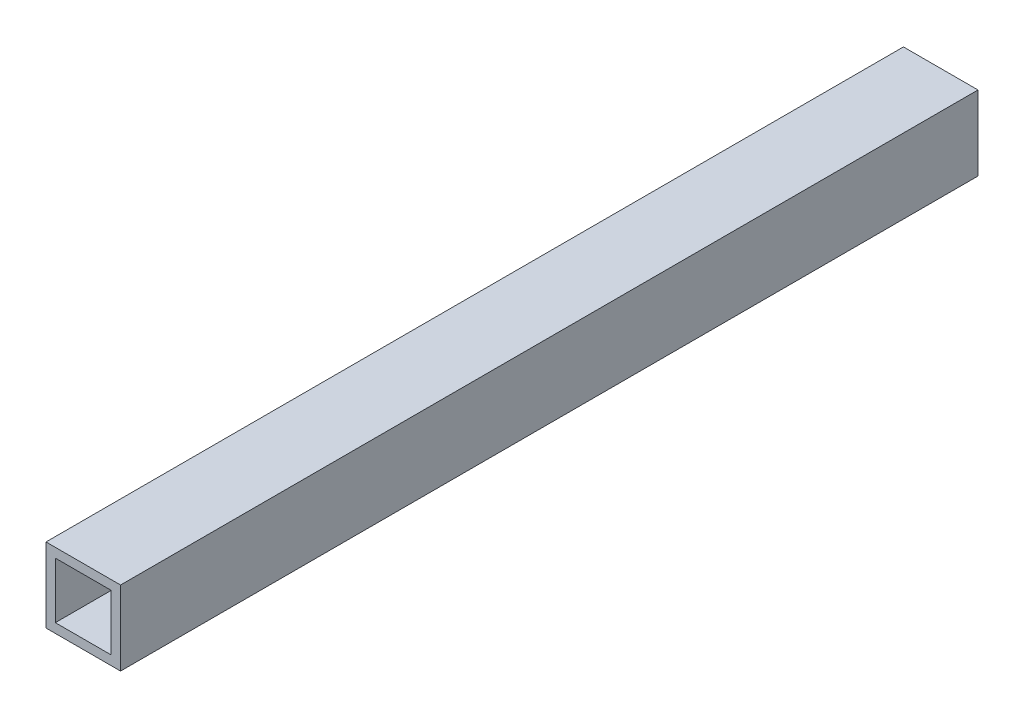
ISO-10303-21;
HEADER;
FILE_DESCRIPTION(('STEP AP214'),'2;1');
FILE_NAME('part.step','',(''),(''),'','','');
FILE_SCHEMA(('AUTOMOTIVE_DESIGN { 1 0 10303 214 1 1 1 1 }'));
ENDSEC;
DATA;
#1=APPLICATION_CONTEXT('core data for automotive mechanical design processes');
#2=APPLICATION_PROTOCOL_DEFINITION('international standard','automotive_design',2000,#1);
#3=PRODUCT_CONTEXT('',#1,'mechanical');
#4=PRODUCT('Part','Part','',(#3));
#5=PRODUCT_RELATED_PRODUCT_CATEGORY('part','',(#4));
#6=PRODUCT_DEFINITION_FORMATION('','',#4);
#7=PRODUCT_DEFINITION_CONTEXT('part definition',#1,'design');
#8=PRODUCT_DEFINITION('design','',#6,#7);
#9=PRODUCT_DEFINITION_SHAPE('','',#8);
#10=(LENGTH_UNIT() NAMED_UNIT(*) SI_UNIT(.MILLI.,.METRE.));
#11=(NAMED_UNIT(*) PLANE_ANGLE_UNIT() SI_UNIT($,.RADIAN.));
#12=(NAMED_UNIT(*) SI_UNIT($,.STERADIAN.) SOLID_ANGLE_UNIT());
#13=UNCERTAINTY_MEASURE_WITH_UNIT(LENGTH_MEASURE(1.E-05),#10,'distance_accuracy_value','');
#14=(GEOMETRIC_REPRESENTATION_CONTEXT(3) GLOBAL_UNCERTAINTY_ASSIGNED_CONTEXT((#13)) GLOBAL_UNIT_ASSIGNED_CONTEXT((#10,
#11,#12)) REPRESENTATION_CONTEXT('',''));
#15=CARTESIAN_POINT('',(0.,0.,0.));
#16=DIRECTION('',(0.,0.,1.));
#17=DIRECTION('',(1.,0.,0.));
#18=AXIS2_PLACEMENT_3D('',#15,#16,#17);
#19=CARTESIAN_POINT('',(0.,0.,146.05));
#20=DIRECTION('',(0.,0.,1.));
#21=DIRECTION('',(1.,0.,0.));
#22=AXIS2_PLACEMENT_3D('',#19,#20,#21);
#23=PLANE('',#22);
#24=DIRECTION('',(0.,-1.,0.));
#25=VECTOR('',#24,1.);
#26=CARTESIAN_POINT('',(-12.7,-12.7,146.05));
#27=LINE('',#26,#25);
#28=CARTESIAN_POINT('',(-12.7,12.7,146.05));
#29=VERTEX_POINT('',#28);
#30=CARTESIAN_POINT('',(-12.7,-12.7,146.05));
#31=VERTEX_POINT('',#30);
#32=EDGE_CURVE('E117',#29,#31,#27,.T.);
#33=ORIENTED_EDGE('',*,*,#32,.T.);
#34=DIRECTION('',(1.,0.,0.));
#35=VECTOR('',#34,1.);
#36=CARTESIAN_POINT('',(12.7,-12.7,146.05));
#37=LINE('',#36,#35);
#38=CARTESIAN_POINT('',(12.7,-12.7,146.05));
#39=VERTEX_POINT('',#38);
#40=EDGE_CURVE('E176',#31,#39,#37,.T.);
#41=ORIENTED_EDGE('',*,*,#40,.T.);
#42=DIRECTION('',(0.,1.,0.));
#43=VECTOR('',#42,1.);
#44=CARTESIAN_POINT('',(12.7,-12.7,146.05));
#45=LINE('',#44,#43);
#46=CARTESIAN_POINT('',(12.7,12.7,146.05));
#47=VERTEX_POINT('',#46);
#48=EDGE_CURVE('E179',#39,#47,#45,.T.);
#49=ORIENTED_EDGE('',*,*,#48,.T.);
#50=DIRECTION('',(-1.,0.,0.));
#51=VECTOR('',#50,1.);
#52=CARTESIAN_POINT('',(12.7,12.7,146.05));
#53=LINE('',#52,#51);
#54=EDGE_CURVE('E63',#47,#29,#53,.T.);
#55=ORIENTED_EDGE('',*,*,#54,.T.);
#56=EDGE_LOOP('',(#33,#41,#49,#55));
#57=FACE_BOUND('',#56,.T.);
#58=DIRECTION('',(1.,0.,0.));
#59=VECTOR('',#58,1.);
#60=CARTESIAN_POINT('',(9.525,-9.525,146.05));
#61=LINE('',#60,#59);
#62=CARTESIAN_POINT('',(-9.52499999999999,-9.525,146.05));
#63=VERTEX_POINT('',#62);
#64=CARTESIAN_POINT('',(9.525,-9.525,146.05));
#65=VERTEX_POINT('',#64);
#66=EDGE_CURVE('E158',#63,#65,#61,.T.);
#67=ORIENTED_EDGE('',*,*,#66,.F.);
#68=DIRECTION('',(0.,-1.,0.));
#69=VECTOR('',#68,1.);
#70=CARTESIAN_POINT('',(-9.52499999999999,-9.525,146.05));
#71=LINE('',#70,#69);
#72=CARTESIAN_POINT('',(-9.52499999999999,9.525,146.05));
#73=VERTEX_POINT('',#72);
#74=EDGE_CURVE('E113',#73,#63,#71,.T.);
#75=ORIENTED_EDGE('',*,*,#74,.F.);
#76=DIRECTION('',(-1.,0.,0.));
#77=VECTOR('',#76,1.);
#78=CARTESIAN_POINT('',(9.525,9.525,146.05));
#79=LINE('',#78,#77);
#80=CARTESIAN_POINT('',(9.525,9.525,146.05));
#81=VERTEX_POINT('',#80);
#82=EDGE_CURVE('E164',#81,#73,#79,.T.);
#83=ORIENTED_EDGE('',*,*,#82,.F.);
#84=DIRECTION('',(0.,1.,0.));
#85=VECTOR('',#84,1.);
#86=CARTESIAN_POINT('',(9.525,-9.525,146.05));
#87=LINE('',#86,#85);
#88=EDGE_CURVE('E161',#65,#81,#87,.T.);
#89=ORIENTED_EDGE('',*,*,#88,.F.);
#90=EDGE_LOOP('',(#67,#75,#83,#89));
#91=FACE_BOUND('',#90,.T.);
#92=ADVANCED_FACE('F39',(#57,#91),#23,.T.);
#93=CARTESIAN_POINT('',(-12.7,-12.7,146.05));
#94=DIRECTION('',(1.,0.,0.));
#95=DIRECTION('',(0.,0.,-1.));
#96=AXIS2_PLACEMENT_3D('',#93,#94,#95);
#97=PLANE('',#96);
#98=DIRECTION('',(0.,0.,-1.));
#99=VECTOR('',#98,1.);
#100=CARTESIAN_POINT('',(-12.7,12.7,146.05));
#101=LINE('',#100,#99);
#102=CARTESIAN_POINT('',(-12.7,12.7,-146.05));
#103=VERTEX_POINT('',#102);
#104=EDGE_CURVE('E184',#29,#103,#101,.T.);
#105=ORIENTED_EDGE('',*,*,#104,.T.);
#106=DIRECTION('',(0.,-1.,0.));
#107=VECTOR('',#106,1.);
#108=CARTESIAN_POINT('',(-12.7,-12.7,-146.05));
#109=LINE('',#108,#107);
#110=CARTESIAN_POINT('',(-12.7,-12.7,-146.05));
#111=VERTEX_POINT('',#110);
#112=EDGE_CURVE('E140',#103,#111,#109,.T.);
#113=ORIENTED_EDGE('',*,*,#112,.T.);
#114=DIRECTION('',(0.,0.,-1.));
#115=VECTOR('',#114,1.);
#116=CARTESIAN_POINT('',(-12.7,-12.7,146.05));
#117=LINE('',#116,#115);
#118=EDGE_CURVE('E11',#31,#111,#117,.T.);
#119=ORIENTED_EDGE('',*,*,#118,.F.);
#120=ORIENTED_EDGE('',*,*,#32,.F.);
#121=EDGE_LOOP('',(#105,#113,#119,#120));
#122=FACE_BOUND('',#121,.T.);
#123=ADVANCED_FACE('F41',(#122),#97,.F.);
#124=CARTESIAN_POINT('',(12.7,-12.7,146.05));
#125=DIRECTION('',(0.,1.,0.));
#126=DIRECTION('',(0.,0.,1.));
#127=AXIS2_PLACEMENT_3D('',#124,#125,#126);
#128=PLANE('',#127);
#129=ORIENTED_EDGE('',*,*,#118,.T.);
#130=DIRECTION('',(1.,0.,0.));
#131=VECTOR('',#130,1.);
#132=CARTESIAN_POINT('',(12.7,-12.7,-146.05));
#133=LINE('',#132,#131);
#134=CARTESIAN_POINT('',(12.7,-12.7,-146.05));
#135=VERTEX_POINT('',#134);
#136=EDGE_CURVE('E144',#111,#135,#133,.T.);
#137=ORIENTED_EDGE('',*,*,#136,.T.);
#138=DIRECTION('',(0.,0.,-1.));
#139=VECTOR('',#138,1.);
#140=CARTESIAN_POINT('',(12.7,-12.7,146.05));
#141=LINE('',#140,#139);
#142=EDGE_CURVE('E48',#39,#135,#141,.T.);
#143=ORIENTED_EDGE('',*,*,#142,.F.);
#144=ORIENTED_EDGE('',*,*,#40,.F.);
#145=EDGE_LOOP('',(#129,#137,#143,#144));
#146=FACE_BOUND('',#145,.T.);
#147=ADVANCED_FACE('F200',(#146),#128,.F.);
#148=CARTESIAN_POINT('',(12.7,-12.7,146.05));
#149=DIRECTION('',(-1.,0.,0.));
#150=DIRECTION('',(0.,0.,1.));
#151=AXIS2_PLACEMENT_3D('',#148,#149,#150);
#152=PLANE('',#151);
#153=ORIENTED_EDGE('',*,*,#142,.T.);
#154=DIRECTION('',(0.,1.,0.));
#155=VECTOR('',#154,1.);
#156=CARTESIAN_POINT('',(12.7,-12.7,-146.05));
#157=LINE('',#156,#155);
#158=CARTESIAN_POINT('',(12.7,12.7,-146.05));
#159=VERTEX_POINT('',#158);
#160=EDGE_CURVE('E148',#135,#159,#157,.T.);
#161=ORIENTED_EDGE('',*,*,#160,.T.);
#162=DIRECTION('',(0.,0.,-1.));
#163=VECTOR('',#162,1.);
#164=CARTESIAN_POINT('',(12.7,12.7,146.05));
#165=LINE('',#164,#163);
#166=EDGE_CURVE('E187',#47,#159,#165,.T.);
#167=ORIENTED_EDGE('',*,*,#166,.F.);
#168=ORIENTED_EDGE('',*,*,#48,.F.);
#169=EDGE_LOOP('',(#153,#161,#167,#168));
#170=FACE_BOUND('',#169,.T.);
#171=ADVANCED_FACE('F194',(#170),#152,.F.);
#172=CARTESIAN_POINT('',(12.7,12.7,146.05));
#173=DIRECTION('',(0.,-1.,0.));
#174=DIRECTION('',(0.,0.,-1.));
#175=AXIS2_PLACEMENT_3D('',#172,#173,#174);
#176=PLANE('',#175);
#177=ORIENTED_EDGE('',*,*,#166,.T.);
#178=DIRECTION('',(-1.,0.,0.));
#179=VECTOR('',#178,1.);
#180=CARTESIAN_POINT('',(12.7,12.7,-146.05));
#181=LINE('',#180,#179);
#182=EDGE_CURVE('E152',#159,#103,#181,.T.);
#183=ORIENTED_EDGE('',*,*,#182,.T.);
#184=ORIENTED_EDGE('',*,*,#104,.F.);
#185=ORIENTED_EDGE('',*,*,#54,.F.);
#186=EDGE_LOOP('',(#177,#183,#184,#185));
#187=FACE_BOUND('',#186,.T.);
#188=ADVANCED_FACE('F205',(#187),#176,.F.);
#189=CARTESIAN_POINT('',(-9.52499999999999,-9.525,146.05));
#190=DIRECTION('',(1.,0.,0.));
#191=DIRECTION('',(0.,0.,-1.));
#192=AXIS2_PLACEMENT_3D('',#189,#190,#191);
#193=PLANE('',#192);
#194=DIRECTION('',(0.,0.,-1.));
#195=VECTOR('',#194,1.);
#196=CARTESIAN_POINT('',(-9.52499999999999,-9.525,146.05));
#197=LINE('',#196,#195);
#198=CARTESIAN_POINT('',(-9.52499999999999,-9.525,-146.05));
#199=VERTEX_POINT('',#198);
#200=EDGE_CURVE('E105',#63,#199,#197,.T.);
#201=ORIENTED_EDGE('',*,*,#200,.T.);
#202=DIRECTION('',(0.,-1.,0.));
#203=VECTOR('',#202,1.);
#204=CARTESIAN_POINT('',(-9.52499999999999,-9.525,-146.05));
#205=LINE('',#204,#203);
#206=CARTESIAN_POINT('',(-9.52499999999999,9.525,-146.05));
#207=VERTEX_POINT('',#206);
#208=EDGE_CURVE('E110',#207,#199,#205,.T.);
#209=ORIENTED_EDGE('',*,*,#208,.F.);
#210=DIRECTION('',(0.,0.,-1.));
#211=VECTOR('',#210,1.);
#212=CARTESIAN_POINT('',(-9.52499999999999,9.525,146.05));
#213=LINE('',#212,#211);
#214=EDGE_CURVE('E167',#73,#207,#213,.T.);
#215=ORIENTED_EDGE('',*,*,#214,.F.);
#216=ORIENTED_EDGE('',*,*,#74,.T.);
#217=EDGE_LOOP('',(#201,#209,#215,#216));
#218=FACE_BOUND('',#217,.T.);
#219=ADVANCED_FACE('F107',(#218),#193,.T.);
#220=CARTESIAN_POINT('',(9.525,-9.525,146.05));
#221=DIRECTION('',(0.,1.,0.));
#222=DIRECTION('',(0.,0.,1.));
#223=AXIS2_PLACEMENT_3D('',#220,#221,#222);
#224=PLANE('',#223);
#225=DIRECTION('',(0.,0.,-1.));
#226=VECTOR('',#225,1.);
#227=CARTESIAN_POINT('',(9.525,-9.525,146.05));
#228=LINE('',#227,#226);
#229=CARTESIAN_POINT('',(9.525,-9.525,-146.05));
#230=VERTEX_POINT('',#229);
#231=EDGE_CURVE('E118',#65,#230,#228,.T.);
#232=ORIENTED_EDGE('',*,*,#231,.T.);
#233=DIRECTION('',(1.,0.,0.));
#234=VECTOR('',#233,1.);
#235=CARTESIAN_POINT('',(9.525,-9.525,-146.05));
#236=LINE('',#235,#234);
#237=EDGE_CURVE('E121',#199,#230,#236,.T.);
#238=ORIENTED_EDGE('',*,*,#237,.F.);
#239=ORIENTED_EDGE('',*,*,#200,.F.);
#240=ORIENTED_EDGE('',*,*,#66,.T.);
#241=EDGE_LOOP('',(#232,#238,#239,#240));
#242=FACE_BOUND('',#241,.T.);
#243=ADVANCED_FACE('F122',(#242),#224,.T.);
#244=CARTESIAN_POINT('',(9.525,-9.525,146.05));
#245=DIRECTION('',(-1.,0.,0.));
#246=DIRECTION('',(0.,0.,1.));
#247=AXIS2_PLACEMENT_3D('',#244,#245,#246);
#248=PLANE('',#247);
#249=DIRECTION('',(0.,0.,-1.));
#250=VECTOR('',#249,1.);
#251=CARTESIAN_POINT('',(9.525,9.525,146.05));
#252=LINE('',#251,#250);
#253=CARTESIAN_POINT('',(9.525,9.525,-146.05));
#254=VERTEX_POINT('',#253);
#255=EDGE_CURVE('E55',#81,#254,#252,.T.);
#256=ORIENTED_EDGE('',*,*,#255,.T.);
#257=DIRECTION('',(0.,1.,0.));
#258=VECTOR('',#257,1.);
#259=CARTESIAN_POINT('',(9.525,-9.525,-146.05));
#260=LINE('',#259,#258);
#261=EDGE_CURVE('E128',#230,#254,#260,.T.);
#262=ORIENTED_EDGE('',*,*,#261,.F.);
#263=ORIENTED_EDGE('',*,*,#231,.F.);
#264=ORIENTED_EDGE('',*,*,#88,.T.);
#265=EDGE_LOOP('',(#256,#262,#263,#264));
#266=FACE_BOUND('',#265,.T.);
#267=ADVANCED_FACE('F223',(#266),#248,.T.);
#268=CARTESIAN_POINT('',(9.525,9.525,146.05));
#269=DIRECTION('',(0.,-1.,0.));
#270=DIRECTION('',(0.,0.,-1.));
#271=AXIS2_PLACEMENT_3D('',#268,#269,#270);
#272=PLANE('',#271);
#273=ORIENTED_EDGE('',*,*,#214,.T.);
#274=DIRECTION('',(-1.,0.,0.));
#275=VECTOR('',#274,1.);
#276=CARTESIAN_POINT('',(9.525,9.525,-146.05));
#277=LINE('',#276,#275);
#278=EDGE_CURVE('E132',#254,#207,#277,.T.);
#279=ORIENTED_EDGE('',*,*,#278,.F.);
#280=ORIENTED_EDGE('',*,*,#255,.F.);
#281=ORIENTED_EDGE('',*,*,#82,.T.);
#282=EDGE_LOOP('',(#273,#279,#280,#281));
#283=FACE_BOUND('',#282,.T.);
#284=ADVANCED_FACE('F226',(#283),#272,.T.);
#285=CARTESIAN_POINT('',(0.,0.,-146.05));
#286=DIRECTION('',(0.,0.,1.));
#287=DIRECTION('',(1.,0.,0.));
#288=AXIS2_PLACEMENT_3D('',#285,#286,#287);
#289=PLANE('',#288);
#290=ORIENTED_EDGE('',*,*,#278,.T.);
#291=ORIENTED_EDGE('',*,*,#208,.T.);
#292=ORIENTED_EDGE('',*,*,#237,.T.);
#293=ORIENTED_EDGE('',*,*,#261,.T.);
#294=EDGE_LOOP('',(#290,#291,#292,#293));
#295=FACE_BOUND('',#294,.T.);
#296=ORIENTED_EDGE('',*,*,#112,.F.);
#297=ORIENTED_EDGE('',*,*,#182,.F.);
#298=ORIENTED_EDGE('',*,*,#160,.F.);
#299=ORIENTED_EDGE('',*,*,#136,.F.);
#300=EDGE_LOOP('',(#296,#297,#298,#299));
#301=FACE_BOUND('',#300,.T.);
#302=ADVANCED_FACE('F130',(#295,#301),#289,.F.);
#303=CLOSED_SHELL('',(#92,#123,#147,#171,#188,#219,#243,#267,#284,#302));
#304=MANIFOLD_SOLID_BREP('B2',#303);
#305=ADVANCED_BREP_SHAPE_REPRESENTATION('',(#18,#304),#14);
#306=SHAPE_DEFINITION_REPRESENTATION(#9,#305);
ENDSEC;
END-ISO-10303-21;
